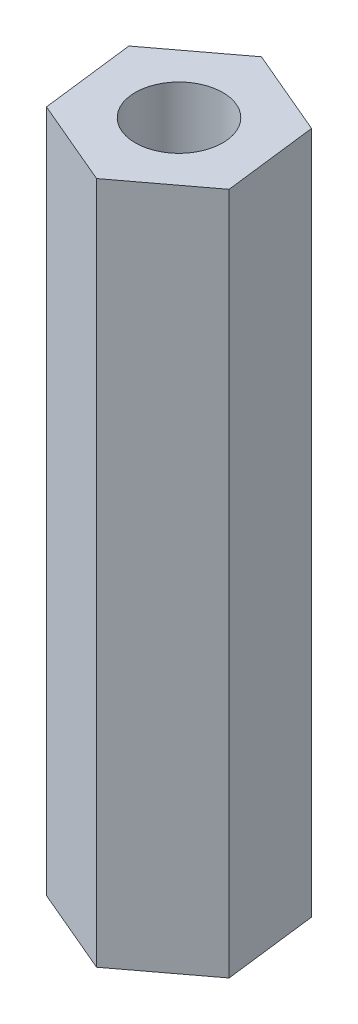
ISO-10303-21;
HEADER;
FILE_DESCRIPTION(('STEP AP214'),'2;1');
FILE_NAME('part.step','',(''),(''),'','','');
FILE_SCHEMA(('AUTOMOTIVE_DESIGN { 1 0 10303 214 1 1 1 1 }'));
ENDSEC;
DATA;
#1=APPLICATION_CONTEXT('core data for automotive mechanical design processes');
#2=APPLICATION_PROTOCOL_DEFINITION('international standard','automotive_design',2000,#1);
#3=PRODUCT_CONTEXT('',#1,'mechanical');
#4=PRODUCT('Part','Part','',(#3));
#5=PRODUCT_RELATED_PRODUCT_CATEGORY('part','',(#4));
#6=PRODUCT_DEFINITION_FORMATION('','',#4);
#7=PRODUCT_DEFINITION_CONTEXT('part definition',#1,'design');
#8=PRODUCT_DEFINITION('design','',#6,#7);
#9=PRODUCT_DEFINITION_SHAPE('','',#8);
#10=(LENGTH_UNIT() NAMED_UNIT(*) SI_UNIT(.MILLI.,.METRE.));
#11=(NAMED_UNIT(*) PLANE_ANGLE_UNIT() SI_UNIT($,.RADIAN.));
#12=(NAMED_UNIT(*) SI_UNIT($,.STERADIAN.) SOLID_ANGLE_UNIT());
#13=UNCERTAINTY_MEASURE_WITH_UNIT(LENGTH_MEASURE(1.E-05),#10,'distance_accuracy_value','');
#14=(GEOMETRIC_REPRESENTATION_CONTEXT(3) GLOBAL_UNCERTAINTY_ASSIGNED_CONTEXT((#13)) GLOBAL_UNIT_ASSIGNED_CONTEXT((#10,
#11,#12)) REPRESENTATION_CONTEXT('',''));
#15=CARTESIAN_POINT('',(0.,0.,0.));
#16=DIRECTION('',(0.,0.,1.));
#17=DIRECTION('',(1.,0.,0.));
#18=AXIS2_PLACEMENT_3D('',#15,#16,#17);
#19=CARTESIAN_POINT('',(0.,25.,0.));
#20=DIRECTION('',(0.,1.,0.));
#21=DIRECTION('',(0.,0.,1.));
#22=AXIS2_PLACEMENT_3D('',#19,#20,#21);
#23=PLANE('',#22);
#24=DIRECTION('',(-0.121573231281397,0.,-0.992582464803706));
#25=VECTOR('',#24,1.);
#26=CARTESIAN_POINT('',(3.18831840783081,25.,1.35448356589777));
#27=LINE('',#26,#25);
#28=CARTESIAN_POINT('',(3.18831840783081,25.,1.35448356589777));
#29=VERTEX_POINT('',#28);
#30=CARTESIAN_POINT('',(2.76717638099141,25.,-2.08392295358615));
#31=VERTEX_POINT('',#30);
#32=EDGE_CURVE('E130',#29,#31,#27,.T.);
#33=ORIENTED_EDGE('',*,*,#32,.T.);
#34=DIRECTION('',(-0.920388245511681,0.,-0.391005725692002));
#35=VECTOR('',#34,1.);
#36=CARTESIAN_POINT('',(2.76717638099141,25.,-2.08392295358615));
#37=LINE('',#36,#35);
#38=CARTESIAN_POINT('',(-0.421142026839402,25.,-3.43840651948392));
#39=VERTEX_POINT('',#38);
#40=EDGE_CURVE('E88',#31,#39,#37,.T.);
#41=ORIENTED_EDGE('',*,*,#40,.T.);
#42=DIRECTION('',(-0.798815014230284,0.,0.601576739111704));
#43=VECTOR('',#42,1.);
#44=CARTESIAN_POINT('',(-0.421142026839402,25.,-3.43840651948392));
#45=LINE('',#44,#43);
#46=CARTESIAN_POINT('',(-3.18831840783081,25.,-1.35448356589777));
#47=VERTEX_POINT('',#46);
#48=EDGE_CURVE('E101',#39,#47,#45,.T.);
#49=ORIENTED_EDGE('',*,*,#48,.T.);
#50=DIRECTION('',(0.121573231281397,0.,0.992582464803706));
#51=VECTOR('',#50,1.);
#52=CARTESIAN_POINT('',(-3.18831840783081,25.,-1.35448356589777));
#53=LINE('',#52,#51);
#54=CARTESIAN_POINT('',(-2.76717638099141,25.,2.08392295358615));
#55=VERTEX_POINT('',#54);
#56=EDGE_CURVE('E95',#47,#55,#53,.T.);
#57=ORIENTED_EDGE('',*,*,#56,.T.);
#58=DIRECTION('',(0.920388245511681,0.,0.391005725692002));
#59=VECTOR('',#58,1.);
#60=CARTESIAN_POINT('',(-2.76717638099141,25.,2.08392295358615));
#61=LINE('',#60,#59);
#62=CARTESIAN_POINT('',(0.421142026839401,25.,3.43840651948392));
#63=VERTEX_POINT('',#62);
#64=EDGE_CURVE('E99',#55,#63,#61,.T.);
#65=ORIENTED_EDGE('',*,*,#64,.T.);
#66=DIRECTION('',(0.798815014230284,0.,-0.601576739111704));
#67=VECTOR('',#66,1.);
#68=CARTESIAN_POINT('',(0.421142026839401,25.,3.43840651948392));
#69=LINE('',#68,#67);
#70=EDGE_CURVE('E51',#63,#29,#69,.T.);
#71=ORIENTED_EDGE('',*,*,#70,.T.);
#72=EDGE_LOOP('',(#33,#41,#49,#57,#65,#71));
#73=FACE_BOUND('',#72,.T.);
#74=CARTESIAN_POINT('',(0.,25.,0.));
#75=DIRECTION('',(0.,1.,0.));
#76=DIRECTION('',(0.,0.,1.));
#77=AXIS2_PLACEMENT_3D('',#74,#75,#76);
#78=CIRCLE('',#77,1.6);
#79=CARTESIAN_POINT('',(0.,25.,1.6));
#80=VERTEX_POINT('',#79);
#81=EDGE_CURVE('E123',#80,#80,#78,.T.);
#82=ORIENTED_EDGE('',*,*,#81,.F.);
#83=EDGE_LOOP('',(#82));
#84=FACE_BOUND('',#83,.T.);
#85=ADVANCED_FACE('F34',(#73,#84),#23,.T.);
#86=CARTESIAN_POINT('',(0.,0.,0.));
#87=DIRECTION('',(0.,1.,0.));
#88=DIRECTION('',(0.,0.,1.));
#89=AXIS2_PLACEMENT_3D('',#86,#87,#88);
#90=PLANE('',#89);
#91=DIRECTION('',(-0.121573231281397,0.,-0.992582464803706));
#92=VECTOR('',#91,1.);
#93=CARTESIAN_POINT('',(3.18831840783081,0.,1.35448356589777));
#94=LINE('',#93,#92);
#95=CARTESIAN_POINT('',(3.18831840783081,0.,1.35448356589777));
#96=VERTEX_POINT('',#95);
#97=CARTESIAN_POINT('',(2.76717638099141,0.,-2.08392295358615));
#98=VERTEX_POINT('',#97);
#99=EDGE_CURVE('E119',#96,#98,#94,.T.);
#100=ORIENTED_EDGE('',*,*,#99,.F.);
#101=DIRECTION('',(0.798815014230284,0.,-0.601576739111704));
#102=VECTOR('',#101,1.);
#103=CARTESIAN_POINT('',(0.421142026839401,0.,3.43840651948392));
#104=LINE('',#103,#102);
#105=CARTESIAN_POINT('',(0.421142026839401,0.,3.43840651948392));
#106=VERTEX_POINT('',#105);
#107=EDGE_CURVE('E80',#106,#96,#104,.T.);
#108=ORIENTED_EDGE('',*,*,#107,.F.);
#109=DIRECTION('',(0.920388245511681,0.,0.391005725692002));
#110=VECTOR('',#109,1.);
#111=CARTESIAN_POINT('',(-2.76717638099141,0.,2.08392295358615));
#112=LINE('',#111,#110);
#113=CARTESIAN_POINT('',(-2.76717638099141,0.,2.08392295358615));
#114=VERTEX_POINT('',#113);
#115=EDGE_CURVE('E74',#114,#106,#112,.T.);
#116=ORIENTED_EDGE('',*,*,#115,.F.);
#117=DIRECTION('',(0.121573231281397,0.,0.992582464803706));
#118=VECTOR('',#117,1.);
#119=CARTESIAN_POINT('',(-3.18831840783081,0.,-1.35448356589777));
#120=LINE('',#119,#118);
#121=CARTESIAN_POINT('',(-3.18831840783081,0.,-1.35448356589777));
#122=VERTEX_POINT('',#121);
#123=EDGE_CURVE('E109',#122,#114,#120,.T.);
#124=ORIENTED_EDGE('',*,*,#123,.F.);
#125=DIRECTION('',(-0.798815014230284,0.,0.601576739111704));
#126=VECTOR('',#125,1.);
#127=CARTESIAN_POINT('',(-0.421142026839402,0.,-3.43840651948392));
#128=LINE('',#127,#126);
#129=CARTESIAN_POINT('',(-0.421142026839402,0.,-3.43840651948392));
#130=VERTEX_POINT('',#129);
#131=EDGE_CURVE('E125',#130,#122,#128,.T.);
#132=ORIENTED_EDGE('',*,*,#131,.F.);
#133=DIRECTION('',(-0.920388245511681,0.,-0.391005725692002));
#134=VECTOR('',#133,1.);
#135=CARTESIAN_POINT('',(2.76717638099141,0.,-2.08392295358615));
#136=LINE('',#135,#134);
#137=EDGE_CURVE('E122',#98,#130,#136,.T.);
#138=ORIENTED_EDGE('',*,*,#137,.F.);
#139=EDGE_LOOP('',(#100,#108,#116,#124,#132,#138));
#140=FACE_BOUND('',#139,.T.);
#141=CARTESIAN_POINT('',(0.,0.,0.));
#142=DIRECTION('',(0.,1.,0.));
#143=DIRECTION('',(0.,0.,1.));
#144=AXIS2_PLACEMENT_3D('',#141,#142,#143);
#145=CIRCLE('',#144,1.6);
#146=CARTESIAN_POINT('',(0.,0.,1.6));
#147=VERTEX_POINT('',#146);
#148=EDGE_CURVE('E223',#147,#147,#145,.T.);
#149=ORIENTED_EDGE('',*,*,#148,.T.);
#150=EDGE_LOOP('',(#149));
#151=FACE_BOUND('',#150,.T.);
#152=ADVANCED_FACE('F139',(#140,#151),#90,.F.);
#153=CARTESIAN_POINT('',(3.18831840783081,25.,1.35448356589777));
#154=DIRECTION('',(-0.992582464803706,0.,0.121573231281397));
#155=DIRECTION('',(0.121573231281397,0.,0.992582464803706));
#156=AXIS2_PLACEMENT_3D('',#153,#154,#155);
#157=PLANE('',#156);
#158=ORIENTED_EDGE('',*,*,#99,.T.);
#159=DIRECTION('',(0.,-1.,0.));
#160=VECTOR('',#159,1.);
#161=CARTESIAN_POINT('',(2.76717638099141,25.,-2.08392295358615));
#162=LINE('',#161,#160);
#163=EDGE_CURVE('E11',#31,#98,#162,.T.);
#164=ORIENTED_EDGE('',*,*,#163,.F.);
#165=ORIENTED_EDGE('',*,*,#32,.F.);
#166=DIRECTION('',(0.,-1.,0.));
#167=VECTOR('',#166,1.);
#168=CARTESIAN_POINT('',(3.18831840783081,25.,1.35448356589777));
#169=LINE('',#168,#167);
#170=EDGE_CURVE('E115',#29,#96,#169,.T.);
#171=ORIENTED_EDGE('',*,*,#170,.T.);
#172=EDGE_LOOP('',(#158,#164,#165,#171));
#173=FACE_BOUND('',#172,.T.);
#174=ADVANCED_FACE('F36',(#173),#157,.F.);
#175=CARTESIAN_POINT('',(2.76717638099141,25.,-2.08392295358615));
#176=DIRECTION('',(-0.391005725692002,0.,0.920388245511681));
#177=DIRECTION('',(0.920388245511681,0.,0.391005725692002));
#178=AXIS2_PLACEMENT_3D('',#175,#176,#177);
#179=PLANE('',#178);
#180=ORIENTED_EDGE('',*,*,#137,.T.);
#181=DIRECTION('',(0.,-1.,0.));
#182=VECTOR('',#181,1.);
#183=CARTESIAN_POINT('',(-0.421142026839402,25.,-3.43840651948392));
#184=LINE('',#183,#182);
#185=EDGE_CURVE('E43',#39,#130,#184,.T.);
#186=ORIENTED_EDGE('',*,*,#185,.F.);
#187=ORIENTED_EDGE('',*,*,#40,.F.);
#188=ORIENTED_EDGE('',*,*,#163,.T.);
#189=EDGE_LOOP('',(#180,#186,#187,#188));
#190=FACE_BOUND('',#189,.T.);
#191=ADVANCED_FACE('F164',(#190),#179,.F.);
#192=CARTESIAN_POINT('',(-0.421142026839402,25.,-3.43840651948392));
#193=DIRECTION('',(0.601576739111704,0.,0.798815014230284));
#194=DIRECTION('',(0.798815014230284,0.,-0.601576739111704));
#195=AXIS2_PLACEMENT_3D('',#192,#193,#194);
#196=PLANE('',#195);
#197=ORIENTED_EDGE('',*,*,#131,.T.);
#198=DIRECTION('',(0.,-1.,0.));
#199=VECTOR('',#198,1.);
#200=CARTESIAN_POINT('',(-3.18831840783081,25.,-1.35448356589777));
#201=LINE('',#200,#199);
#202=EDGE_CURVE('E110',#47,#122,#201,.T.);
#203=ORIENTED_EDGE('',*,*,#202,.F.);
#204=ORIENTED_EDGE('',*,*,#48,.F.);
#205=ORIENTED_EDGE('',*,*,#185,.T.);
#206=EDGE_LOOP('',(#197,#203,#204,#205));
#207=FACE_BOUND('',#206,.T.);
#208=ADVANCED_FACE('F136',(#207),#196,.F.);
#209=CARTESIAN_POINT('',(-3.18831840783081,25.,-1.35448356589777));
#210=DIRECTION('',(0.992582464803706,0.,-0.121573231281397));
#211=DIRECTION('',(-0.121573231281397,0.,-0.992582464803706));
#212=AXIS2_PLACEMENT_3D('',#209,#210,#211);
#213=PLANE('',#212);
#214=ORIENTED_EDGE('',*,*,#123,.T.);
#215=DIRECTION('',(0.,-1.,0.));
#216=VECTOR('',#215,1.);
#217=CARTESIAN_POINT('',(-2.76717638099141,25.,2.08392295358615));
#218=LINE('',#217,#216);
#219=EDGE_CURVE('E106',#55,#114,#218,.T.);
#220=ORIENTED_EDGE('',*,*,#219,.F.);
#221=ORIENTED_EDGE('',*,*,#56,.F.);
#222=ORIENTED_EDGE('',*,*,#202,.T.);
#223=EDGE_LOOP('',(#214,#220,#221,#222));
#224=FACE_BOUND('',#223,.T.);
#225=ADVANCED_FACE('F107',(#224),#213,.F.);
#226=CARTESIAN_POINT('',(-2.76717638099141,25.,2.08392295358615));
#227=DIRECTION('',(0.391005725692002,0.,-0.920388245511681));
#228=DIRECTION('',(-0.920388245511681,0.,-0.391005725692002));
#229=AXIS2_PLACEMENT_3D('',#226,#227,#228);
#230=PLANE('',#229);
#231=ORIENTED_EDGE('',*,*,#115,.T.);
#232=DIRECTION('',(0.,-1.,0.));
#233=VECTOR('',#232,1.);
#234=CARTESIAN_POINT('',(0.421142026839401,25.,3.43840651948392));
#235=LINE('',#234,#233);
#236=EDGE_CURVE('E111',#63,#106,#235,.T.);
#237=ORIENTED_EDGE('',*,*,#236,.F.);
#238=ORIENTED_EDGE('',*,*,#64,.F.);
#239=ORIENTED_EDGE('',*,*,#219,.T.);
#240=EDGE_LOOP('',(#231,#237,#238,#239));
#241=FACE_BOUND('',#240,.T.);
#242=ADVANCED_FACE('F113',(#241),#230,.F.);
#243=CARTESIAN_POINT('',(0.421142026839401,25.,3.43840651948392));
#244=DIRECTION('',(-0.601576739111704,0.,-0.798815014230284));
#245=DIRECTION('',(-0.798815014230284,0.,0.601576739111704));
#246=AXIS2_PLACEMENT_3D('',#243,#244,#245);
#247=PLANE('',#246);
#248=ORIENTED_EDGE('',*,*,#107,.T.);
#249=ORIENTED_EDGE('',*,*,#170,.F.);
#250=ORIENTED_EDGE('',*,*,#70,.F.);
#251=ORIENTED_EDGE('',*,*,#236,.T.);
#252=EDGE_LOOP('',(#248,#249,#250,#251));
#253=FACE_BOUND('',#252,.T.);
#254=ADVANCED_FACE('F144',(#253),#247,.F.);
#255=CARTESIAN_POINT('',(0.,25.,0.));
#256=DIRECTION('',(0.,-1.,0.));
#257=DIRECTION('',(0.,0.,-1.));
#258=AXIS2_PLACEMENT_3D('',#255,#256,#257);
#259=CYLINDRICAL_SURFACE('',#258,1.6);
#260=ORIENTED_EDGE('',*,*,#81,.T.);
#261=EDGE_LOOP('',(#260));
#262=FACE_BOUND('',#261,.T.);
#263=ORIENTED_EDGE('',*,*,#148,.F.);
#264=EDGE_LOOP('',(#263));
#265=FACE_BOUND('',#264,.T.);
#266=ADVANCED_FACE('F146',(#262,#265),#259,.F.);
#267=CLOSED_SHELL('',(#85,#152,#174,#191,#208,#225,#242,#254,#266));
#268=MANIFOLD_SOLID_BREP('B2',#267);
#269=ADVANCED_BREP_SHAPE_REPRESENTATION('',(#18,#268),#14);
#270=SHAPE_DEFINITION_REPRESENTATION(#9,#269);
ENDSEC;
END-ISO-10303-21;
